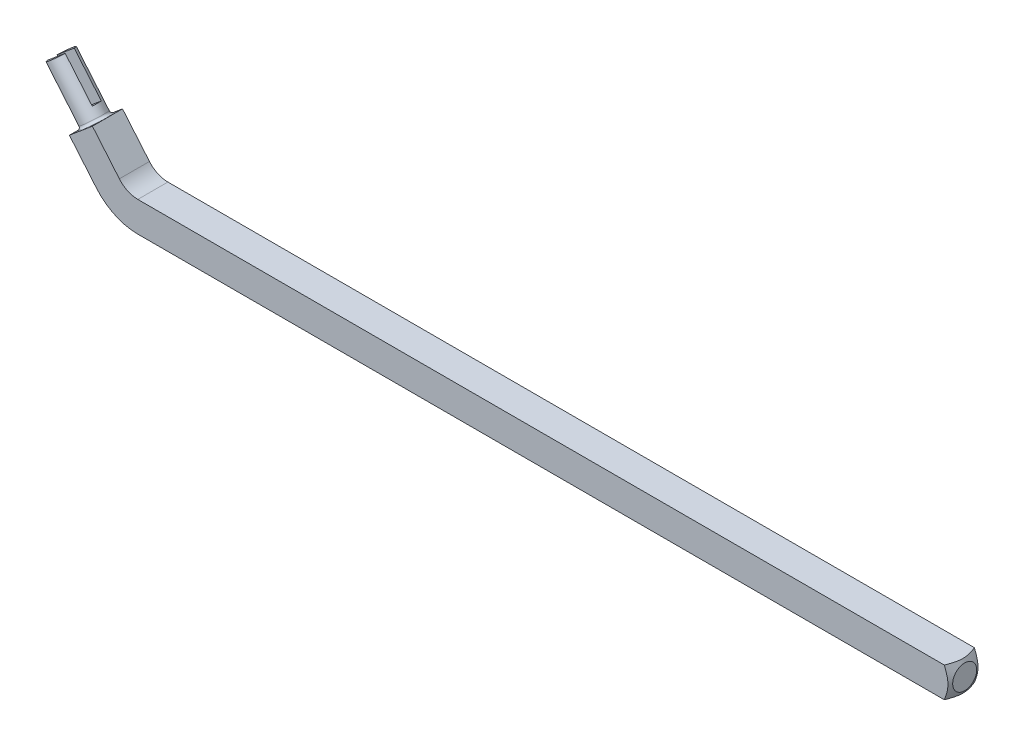
ISO-10303-21;
HEADER;
FILE_DESCRIPTION(('STEP AP214'),'2;1');
FILE_NAME('part.step','',(''),(''),'','','');
FILE_SCHEMA(('AUTOMOTIVE_DESIGN { 1 0 10303 214 1 1 1 1 }'));
ENDSEC;
DATA;
#1=APPLICATION_CONTEXT('core data for automotive mechanical design processes');
#2=APPLICATION_PROTOCOL_DEFINITION('international standard','automotive_design',2000,#1);
#3=PRODUCT_CONTEXT('',#1,'mechanical');
#4=PRODUCT('Part','Part','',(#3));
#5=PRODUCT_RELATED_PRODUCT_CATEGORY('part','',(#4));
#6=PRODUCT_DEFINITION_FORMATION('','',#4);
#7=PRODUCT_DEFINITION_CONTEXT('part definition',#1,'design');
#8=PRODUCT_DEFINITION('design','',#6,#7);
#9=PRODUCT_DEFINITION_SHAPE('','',#8);
#10=(LENGTH_UNIT() NAMED_UNIT(*) SI_UNIT(.MILLI.,.METRE.));
#11=(NAMED_UNIT(*) PLANE_ANGLE_UNIT() SI_UNIT($,.RADIAN.));
#12=(NAMED_UNIT(*) SI_UNIT($,.STERADIAN.) SOLID_ANGLE_UNIT());
#13=UNCERTAINTY_MEASURE_WITH_UNIT(LENGTH_MEASURE(1.E-05),#10,'distance_accuracy_value','');
#14=(GEOMETRIC_REPRESENTATION_CONTEXT(3) GLOBAL_UNCERTAINTY_ASSIGNED_CONTEXT((#13)) GLOBAL_UNIT_ASSIGNED_CONTEXT((#10,
#11,#12)) REPRESENTATION_CONTEXT('',''));
#15=CARTESIAN_POINT('',(0.,0.,0.));
#16=DIRECTION('',(0.,0.,1.));
#17=DIRECTION('',(1.,0.,0.));
#18=AXIS2_PLACEMENT_3D('',#15,#16,#17);
#19=CARTESIAN_POINT('',(-8.34298720466287,6.0534754069734,-2.5));
#20=DIRECTION('',(-0.642787609686543,0.766044443118975,0.));
#21=DIRECTION('',(-0.766044443118975,-0.642787609686543,0.));
#22=AXIS2_PLACEMENT_3D('',#19,#20,#21);
#23=PLANE('',#22);
#24=DIRECTION('',(0.,0.,1.));
#25=VECTOR('',#24,1.);
#26=CARTESIAN_POINT('',(-8.34298720466287,6.0534754069734,-2.5));
#27=LINE('',#26,#25);
#28=CARTESIAN_POINT('',(-8.34298720466287,6.0534754069734,-2.5));
#29=VERTEX_POINT('',#28);
#30=CARTESIAN_POINT('',(-8.34298720466287,6.0534754069734,0.));
#31=VERTEX_POINT('',#30);
#32=EDGE_CURVE('E275',#29,#31,#27,.T.);
#33=ORIENTED_EDGE('',*,*,#32,.T.);
#34=CARTESIAN_POINT('',(-6.42787609686543,7.66044443118975,0.));
#35=DIRECTION('',(-0.642787609686543,0.766044443118975,0.));
#36=DIRECTION('',(-0.766044443118975,-0.642787609686543,0.));
#37=AXIS2_PLACEMENT_3D('',#34,#35,#36);
#38=CIRCLE('',#37,2.5);
#39=CARTESIAN_POINT('',(-6.42787609686543,7.66044443118975,-2.5));
#40=VERTEX_POINT('',#39);
#41=EDGE_CURVE('E13',#31,#40,#38,.F.);
#42=ORIENTED_EDGE('',*,*,#41,.T.);
#43=DIRECTION('',(-0.766044443118975,-0.642787609686543,0.));
#44=VECTOR('',#43,1.);
#45=CARTESIAN_POINT('',(-8.34298720466287,6.0534754069734,-2.5));
#46=LINE('',#45,#44);
#47=EDGE_CURVE('E277',#40,#29,#46,.T.);
#48=ORIENTED_EDGE('',*,*,#47,.T.);
#49=EDGE_LOOP('',(#33,#42,#48));
#50=FACE_BOUND('',#49,.T.);
#51=ADVANCED_FACE('F54',(#50),#23,.T.);
#52=CARTESIAN_POINT('',(-4.512764989068,9.26741345540611,-2.5));
#53=VERTEX_POINT('',#52);
#54=EDGE_CURVE('E375',#53,#40,#46,.T.);
#55=ORIENTED_EDGE('',*,*,#54,.T.);
#56=CARTESIAN_POINT('',(-6.42787609686543,7.66044443118975,0.));
#57=DIRECTION('',(-0.642787609686543,0.766044443118975,0.));
#58=DIRECTION('',(-0.766044443118975,-0.642787609686543,0.));
#59=AXIS2_PLACEMENT_3D('',#56,#57,#58);
#60=CIRCLE('',#59,2.5);
#61=CARTESIAN_POINT('',(-4.512764989068,9.26741345540611,0.));
#62=VERTEX_POINT('',#61);
#63=EDGE_CURVE('E63',#40,#62,#60,.F.);
#64=ORIENTED_EDGE('',*,*,#63,.T.);
#65=DIRECTION('',(0.,0.,1.));
#66=VECTOR('',#65,1.);
#67=CARTESIAN_POINT('',(-4.512764989068,9.26741345540611,-2.5));
#68=LINE('',#67,#66);
#69=EDGE_CURVE('E383',#53,#62,#68,.T.);
#70=ORIENTED_EDGE('',*,*,#69,.F.);
#71=EDGE_LOOP('',(#55,#64,#70));
#72=FACE_BOUND('',#71,.T.);
#73=ADVANCED_FACE('F268',(#72),#23,.T.);
#74=CARTESIAN_POINT('',(-4.512764989068,9.26741345540611,2.5));
#75=VERTEX_POINT('',#74);
#76=EDGE_CURVE('E380',#62,#75,#68,.T.);
#77=ORIENTED_EDGE('',*,*,#76,.F.);
#78=CARTESIAN_POINT('',(-6.42787609686543,7.66044443118975,0.));
#79=DIRECTION('',(-0.642787609686543,0.766044443118975,0.));
#80=DIRECTION('',(-0.766044443118975,-0.642787609686543,0.));
#81=AXIS2_PLACEMENT_3D('',#78,#79,#80);
#82=CIRCLE('',#81,2.5);
#83=CARTESIAN_POINT('',(-6.42787609686543,7.66044443118975,2.5));
#84=VERTEX_POINT('',#83);
#85=EDGE_CURVE('E287',#62,#84,#82,.F.);
#86=ORIENTED_EDGE('',*,*,#85,.T.);
#87=DIRECTION('',(-0.766044443118975,-0.642787609686543,0.));
#88=VECTOR('',#87,1.);
#89=CARTESIAN_POINT('',(-8.34298720466287,6.0534754069734,2.5));
#90=LINE('',#89,#88);
#91=EDGE_CURVE('E358',#75,#84,#90,.T.);
#92=ORIENTED_EDGE('',*,*,#91,.F.);
#93=EDGE_LOOP('',(#77,#86,#92));
#94=FACE_BOUND('',#93,.T.);
#95=ADVANCED_FACE('F261',(#94),#23,.T.);
#96=CARTESIAN_POINT('',(-12.2129645840443,14.5548444192605,0.));
#97=DIRECTION('',(-0.642787609686543,0.766044443118975,0.));
#98=DIRECTION('',(-0.766044443118975,-0.642787609686543,0.));
#99=AXIS2_PLACEMENT_3D('',#96,#97,#98);
#100=PLANE('',#99);
#101=DIRECTION('',(0.766044443118975,0.642787609686543,0.));
#102=VECTOR('',#101,1.);
#103=CARTESIAN_POINT('',(-12.2129645840443,14.5548444192605,0.749999999999999));
#104=LINE('',#103,#102);
#105=CARTESIAN_POINT('',(-13.6332489940711,13.3630842946402,0.749999999999999));
#106=VERTEX_POINT('',#105);
#107=CARTESIAN_POINT('',(-10.7926801740176,15.7466045438808,0.749999999999999));
#108=VERTEX_POINT('',#107);
#109=EDGE_CURVE('E166',#106,#108,#104,.T.);
#110=ORIENTED_EDGE('',*,*,#109,.F.);
#111=CARTESIAN_POINT('',(-12.2129645840443,14.5548444192605,0.));
#112=DIRECTION('',(-0.642787609686543,0.766044443118975,0.));
#113=DIRECTION('',(-0.766044443118975,-0.642787609686543,0.));
#114=AXIS2_PLACEMENT_3D('',#111,#112,#113);
#115=CIRCLE('',#114,2.);
#116=EDGE_CURVE('E181',#106,#108,#115,.T.);
#117=ORIENTED_EDGE('',*,*,#116,.T.);
#118=EDGE_LOOP('',(#110,#117));
#119=FACE_BOUND('',#118,.T.);
#120=ADVANCED_FACE('F409',(#119),#100,.T.);
#121=CARTESIAN_POINT('',(-1.16576914538749,-2.5,-2.5));
#122=DIRECTION('',(0.,-1.,0.));
#123=DIRECTION('',(0.,0.,-1.));
#124=AXIS2_PLACEMENT_3D('',#121,#122,#123);
#125=PLANE('',#124);
#126=DIRECTION('',(1.,0.,0.));
#127=VECTOR('',#126,1.);
#128=CARTESIAN_POINT('',(-1.16576914538749,-2.5,2.5));
#129=LINE('',#128,#127);
#130=CARTESIAN_POINT('',(3.03099977800747,-2.5,2.5));
#131=VERTEX_POINT('',#130);
#132=CARTESIAN_POINT('',(137.11345908606,-2.5,2.5));
#133=VERTEX_POINT('',#132);
#134=EDGE_CURVE('E247',#131,#133,#129,.T.);
#135=ORIENTED_EDGE('',*,*,#134,.F.);
#136=DIRECTION('',(0.,0.,1.));
#137=VECTOR('',#136,1.);
#138=CARTESIAN_POINT('',(3.03099977800747,-2.5,-2.5));
#139=LINE('',#138,#137);
#140=CARTESIAN_POINT('',(3.03099977800747,-2.5,-2.5));
#141=VERTEX_POINT('',#140);
#142=EDGE_CURVE('E308',#131,#141,#139,.F.);
#143=ORIENTED_EDGE('',*,*,#142,.T.);
#144=DIRECTION('',(1.,0.,0.));
#145=VECTOR('',#144,1.);
#146=CARTESIAN_POINT('',(-1.16576914538749,-2.5,-2.5));
#147=LINE('',#146,#145);
#148=CARTESIAN_POINT('',(137.11345908606,-2.5,-2.5));
#149=VERTEX_POINT('',#148);
#150=EDGE_CURVE('E346',#141,#149,#147,.T.);
#151=ORIENTED_EDGE('',*,*,#150,.T.);
#152=CARTESIAN_POINT('',(134.265798622587,-2.5,-8.09036994374947));
#153=CARTESIAN_POINT('',(134.364325071174,-2.5,-7.91174397533074));
#154=CARTESIAN_POINT('',(134.462642816484,-2.5,-7.73300244143315));
#155=CARTESIAN_POINT('',(134.658748374971,-2.5,-7.37522634154136));
#156=CARTESIAN_POINT('',(134.75653618213,-2.5,-7.19619177224946));
#157=CARTESIAN_POINT('',(134.9515144638,-2.5,-6.83768465921551));
#158=CARTESIAN_POINT('',(135.048704624945,-2.5,-6.65821194491864));
#159=CARTESIAN_POINT('',(135.242279610896,-2.5,-6.29883347076645));
#160=CARTESIAN_POINT('',(135.338664439387,-2.5,-6.11892771289773));
#161=CARTESIAN_POINT('',(135.531991673756,-2.5,-5.75561570489188));
#162=CARTESIAN_POINT('',(135.628917244225,-2.5,-5.57220048581406));
#163=CARTESIAN_POINT('',(135.821409670884,-2.5,-5.20465875354999));
#164=CARTESIAN_POINT('',(135.916976535032,-2.5,-5.02053224453755));
#165=CARTESIAN_POINT('',(136.106296399159,-2.5,-4.65139729768638));
#166=CARTESIAN_POINT('',(136.200049788191,-2.5,-4.46638905986643));
#167=CARTESIAN_POINT('',(136.385127954238,-2.5,-4.09516444076155));
#168=CARTESIAN_POINT('',(136.476452795391,-2.5,-3.90894809154498));
#169=CARTESIAN_POINT('',(136.657220802573,-2.5,-3.53178230740229));
#170=CARTESIAN_POINT('',(136.746607503788,-2.5,-3.3408056357966));
#171=CARTESIAN_POINT('',(136.920370635018,-2.5,-2.95651698734556));
#172=CARTESIAN_POINT('',(137.004745823123,-2.5,-2.76320444580987));
#173=CARTESIAN_POINT('',(137.165841954031,-2.5,-2.37384979418392));
#174=CARTESIAN_POINT('',(137.242579438558,-2.5,-2.17781467927853));
#175=CARTESIAN_POINT('',(137.349054610207,-2.5,-1.88070005057552));
#176=CARTESIAN_POINT('',(137.383102089547,-2.5,-1.78117100722463));
#177=CARTESIAN_POINT('',(137.447618748707,-2.5,-1.5809189106024));
#178=CARTESIAN_POINT('',(137.478086781975,-2.5,-1.48019548606441));
#179=CARTESIAN_POINT('',(137.544671389408,-2.5,-1.24139647827977));
#180=CARTESIAN_POINT('',(137.578936136689,-2.5,-1.10279161799555));
#181=CARTESIAN_POINT('',(137.636907163404,-2.5,-0.823422082106642));
#182=CARTESIAN_POINT('',(137.660619992429,-2.5,-0.682658802528919));
#183=CARTESIAN_POINT('',(137.695070559895,-2.5,-0.400493610699158));
#184=CARTESIAN_POINT('',(137.705897273818,-2.5,-0.259102924670878));
#185=CARTESIAN_POINT('',(137.713564996173,-2.5,0.0240732922924882));
#186=CARTESIAN_POINT('',(137.710407327643,-2.5,0.16585878460728));
#187=CARTESIAN_POINT('',(137.694382354105,-2.5,0.393753584749213));
#188=CARTESIAN_POINT('',(137.685742284477,-2.5,0.480189240983088));
#189=CARTESIAN_POINT('',(137.663765272104,-2.5,0.65246646602329));
#190=CARTESIAN_POINT('',(137.650427881064,-2.5,0.73830797732912));
#191=CARTESIAN_POINT('',(137.604085884971,-2.5,0.994784224473355));
#192=CARTESIAN_POINT('',(137.564758712941,-2.5,1.16428078829332));
#193=CARTESIAN_POINT('',(137.472699592075,-2.5,1.50346061082879));
#194=CARTESIAN_POINT('',(137.419691749003,-2.5,1.67306592586023));
#195=CARTESIAN_POINT('',(137.333401313365,-2.5,1.9250779331676));
#196=CARTESIAN_POINT('',(137.30351089151,-2.5,2.00867558792489));
#197=CARTESIAN_POINT('',(137.241826697825,-2.5,2.1751649697745));
#198=CARTESIAN_POINT('',(137.210032962114,-2.5,2.25805671022884));
#199=CARTESIAN_POINT('',(137.125585639625,-2.5,2.47207281476906));
#200=CARTESIAN_POINT('',(137.07171974973,-2.5,2.60271766268198));
#201=CARTESIAN_POINT('',(136.960960147072,-2.5,2.862722132208));
#202=CARTESIAN_POINT('',(136.904066152504,-2.5,2.99208163286878));
#203=CARTESIAN_POINT('',(136.787940878976,-2.5,3.24979174851261));
#204=CARTESIAN_POINT('',(136.728708885655,-2.5,3.37814204054657));
#205=CARTESIAN_POINT('',(136.608434508829,-2.5,3.63399311044653));
#206=CARTESIAN_POINT('',(136.547392074517,-2.5,3.76149386434806));
#207=CARTESIAN_POINT('',(136.361967683909,-2.5,4.14332926557269));
#208=CARTESIAN_POINT('',(136.235457299503,-2.5,4.39662912608293));
#209=CARTESIAN_POINT('',(135.978815505331,-2.5,4.90131505529341));
#210=CARTESIAN_POINT('',(135.84868476501,-2.5,5.15270146700614));
#211=CARTESIAN_POINT('',(135.59899955628,-2.5,5.62920865528513));
#212=CARTESIAN_POINT('',(135.479681444776,-2.5,5.85445350174167));
#213=CARTESIAN_POINT('',(135.239552823108,-2.5,6.30416058698997));
#214=CARTESIAN_POINT('',(135.118742232589,-2.5,6.52862278280244));
#215=CARTESIAN_POINT('',(134.876388341815,-2.5,6.976238634142));
#216=CARTESIAN_POINT('',(134.754848537991,-2.5,7.19939418506569));
#217=CARTESIAN_POINT('',(134.510910018402,-2.5,7.64521460497603));
#218=CARTESIAN_POINT('',(134.388511365282,-2.5,7.86787950822606));
#219=CARTESIAN_POINT('',(134.265798622587,-2.5,8.09036994374947));
#220=B_SPLINE_CURVE_WITH_KNOTS('',3,(#152,#153,#154,#155,#156,#157,#158,#159,#160,#161,#162,
#163,#164,#165,#166,#167,#168,#169,#170,#171,#172,#173,#174,#175,#176,#177,#178,#179,#180,#181,
#182,#183,#184,#185,#186,#187,#188,#189,#190,#191,#192,#193,#194,#195,#196,#197,#198,#199,#200,
#201,#202,#203,#204,#205,#206,#207,#208,#209,#210,#211,#212,#213,#214,#215,#216,#217,#218,#219),
.UNSPECIFIED.,.F.,.F.,(4,2,2,2,2,2,2,2,2,2,2,2,2,2,2,2,2,2,2,2,2,2,2,2,2,2,2,2,2,2,2,2,2,4),(0.,
0.611990871957453,1.22398867901651,1.83628388567891,2.44857628875396,3.07092344841238,
3.69326696169653,4.31547544591525,4.93766748114063,5.57019594714834,6.20288051255682,
6.83416354832187,7.14968337444959,7.46530399253116,7.89331133141584,8.32105263365622,
8.74582302832444,9.17055323705397,9.43102870420546,9.69152903688075,10.2127989082309,
10.7455377658767,11.0118618191968,11.2781808200966,11.7020680839718,12.12599486528,
12.5500521929596,12.9741214325797,13.8234738159649,14.6726701748433,15.4373510405286,
16.2020732574193,16.9643918988286,17.7266555018219),.UNSPECIFIED.);
#221=EDGE_CURVE('E205',#149,#133,#220,.T.);
#222=ORIENTED_EDGE('',*,*,#221,.T.);
#223=EDGE_LOOP('',(#135,#143,#151,#222));
#224=FACE_BOUND('',#223,.T.);
#225=ADVANCED_FACE('F343',(#224),#125,.T.);
#226=CARTESIAN_POINT('',(1.16576914538749,2.5,-2.5));
#227=DIRECTION('',(0.,1.,0.));
#228=DIRECTION('',(0.,0.,1.));
#229=AXIS2_PLACEMENT_3D('',#226,#227,#228);
#230=PLANE('',#229);
#231=DIRECTION('',(-1.,0.,0.));
#232=VECTOR('',#231,1.);
#233=CARTESIAN_POINT('',(1.16576914538749,2.5,-2.5));
#234=LINE('',#233,#232);
#235=CARTESIAN_POINT('',(137.11345908606,2.5,-2.5));
#236=VERTEX_POINT('',#235);
#237=CARTESIAN_POINT('',(3.03099977800747,2.5,-2.5));
#238=VERTEX_POINT('',#237);
#239=EDGE_CURVE('E367',#236,#238,#234,.T.);
#240=ORIENTED_EDGE('',*,*,#239,.T.);
#241=DIRECTION('',(0.,0.,1.));
#242=VECTOR('',#241,1.);
#243=CARTESIAN_POINT('',(3.03099977800747,2.5,2.5));
#244=LINE('',#243,#242);
#245=CARTESIAN_POINT('',(3.03099977800747,2.5,2.5));
#246=VERTEX_POINT('',#245);
#247=EDGE_CURVE('E326',#238,#246,#244,.T.);
#248=ORIENTED_EDGE('',*,*,#247,.T.);
#249=DIRECTION('',(-1.,0.,0.));
#250=VECTOR('',#249,1.);
#251=CARTESIAN_POINT('',(1.16576914538749,2.5,2.5));
#252=LINE('',#251,#250);
#253=CARTESIAN_POINT('',(137.11345908606,2.5,2.5));
#254=VERTEX_POINT('',#253);
#255=EDGE_CURVE('E350',#254,#246,#252,.T.);
#256=ORIENTED_EDGE('',*,*,#255,.F.);
#257=CARTESIAN_POINT('',(134.265798622587,2.5,8.09036994374947));
#258=CARTESIAN_POINT('',(134.364325071174,2.5,7.91174397533074));
#259=CARTESIAN_POINT('',(134.462642816484,2.5,7.73300244143315));
#260=CARTESIAN_POINT('',(134.658748374971,2.5,7.37522634154136));
#261=CARTESIAN_POINT('',(134.75653618213,2.5,7.19619177224946));
#262=CARTESIAN_POINT('',(134.9515144638,2.5,6.83768465921551));
#263=CARTESIAN_POINT('',(135.048704624945,2.5,6.65821194491864));
#264=CARTESIAN_POINT('',(135.242279610896,2.5,6.29883347076645));
#265=CARTESIAN_POINT('',(135.338664439387,2.5,6.11892771289773));
#266=CARTESIAN_POINT('',(135.531991673756,2.5,5.75561570489188));
#267=CARTESIAN_POINT('',(135.628917244225,2.5,5.57220048581406));
#268=CARTESIAN_POINT('',(135.821409670884,2.5,5.20465875354999));
#269=CARTESIAN_POINT('',(135.916976535032,2.5,5.02053224453755));
#270=CARTESIAN_POINT('',(136.106296399159,2.5,4.65139729768638));
#271=CARTESIAN_POINT('',(136.200049788191,2.5,4.46638905986643));
#272=CARTESIAN_POINT('',(136.385127954238,2.5,4.09516444076155));
#273=CARTESIAN_POINT('',(136.476452795391,2.5,3.90894809154498));
#274=CARTESIAN_POINT('',(136.657220802573,2.5,3.53178230740229));
#275=CARTESIAN_POINT('',(136.746607503788,2.5,3.3408056357966));
#276=CARTESIAN_POINT('',(136.920370635018,2.5,2.95651698734556));
#277=CARTESIAN_POINT('',(137.004745823123,2.5,2.76320444580987));
#278=CARTESIAN_POINT('',(137.165841954031,2.5,2.37384979418392));
#279=CARTESIAN_POINT('',(137.242579438558,2.5,2.17781467927853));
#280=CARTESIAN_POINT('',(137.349054610207,2.5,1.88070005057552));
#281=CARTESIAN_POINT('',(137.383102089547,2.5,1.78117100722463));
#282=CARTESIAN_POINT('',(137.447618748707,2.5,1.5809189106024));
#283=CARTESIAN_POINT('',(137.478086781975,2.5,1.48019548606441));
#284=CARTESIAN_POINT('',(137.544671389408,2.5,1.24139647827977));
#285=CARTESIAN_POINT('',(137.578936136689,2.5,1.10279161799555));
#286=CARTESIAN_POINT('',(137.636907163404,2.5,0.823422082106642));
#287=CARTESIAN_POINT('',(137.660619992429,2.5,0.682658802528919));
#288=CARTESIAN_POINT('',(137.695070559895,2.5,0.400493610699158));
#289=CARTESIAN_POINT('',(137.705897273818,2.5,0.259102924670878));
#290=CARTESIAN_POINT('',(137.713564996173,2.5,-0.0240732922924882));
#291=CARTESIAN_POINT('',(137.710407327643,2.5,-0.16585878460728));
#292=CARTESIAN_POINT('',(137.694382354105,2.5,-0.393753584749213));
#293=CARTESIAN_POINT('',(137.685742284477,2.5,-0.480189240983088));
#294=CARTESIAN_POINT('',(137.663765272104,2.5,-0.65246646602329));
#295=CARTESIAN_POINT('',(137.650427881064,2.5,-0.73830797732912));
#296=CARTESIAN_POINT('',(137.604085884971,2.5,-0.994784224473355));
#297=CARTESIAN_POINT('',(137.564758712941,2.5,-1.16428078829332));
#298=CARTESIAN_POINT('',(137.472699592075,2.5,-1.50346061082879));
#299=CARTESIAN_POINT('',(137.419691749003,2.5,-1.67306592586023));
#300=CARTESIAN_POINT('',(137.333401313365,2.5,-1.9250779331676));
#301=CARTESIAN_POINT('',(137.30351089151,2.5,-2.00867558792489));
#302=CARTESIAN_POINT('',(137.241826697825,2.5,-2.1751649697745));
#303=CARTESIAN_POINT('',(137.210032962114,2.5,-2.25805671022884));
#304=CARTESIAN_POINT('',(137.125585639625,2.5,-2.47207281476906));
#305=CARTESIAN_POINT('',(137.07171974973,2.5,-2.60271766268198));
#306=CARTESIAN_POINT('',(136.960960147072,2.5,-2.862722132208));
#307=CARTESIAN_POINT('',(136.904066152504,2.5,-2.99208163286878));
#308=CARTESIAN_POINT('',(136.787940878976,2.5,-3.24979174851261));
#309=CARTESIAN_POINT('',(136.728708885655,2.5,-3.37814204054657));
#310=CARTESIAN_POINT('',(136.608434508829,2.5,-3.63399311044653));
#311=CARTESIAN_POINT('',(136.547392074517,2.5,-3.76149386434806));
#312=CARTESIAN_POINT('',(136.361967683909,2.5,-4.14332926557269));
#313=CARTESIAN_POINT('',(136.235457299503,2.5,-4.39662912608293));
#314=CARTESIAN_POINT('',(135.978815505331,2.5,-4.90131505529341));
#315=CARTESIAN_POINT('',(135.84868476501,2.5,-5.15270146700614));
#316=CARTESIAN_POINT('',(135.59899955628,2.5,-5.62920865528513));
#317=CARTESIAN_POINT('',(135.479681444776,2.5,-5.85445350174167));
#318=CARTESIAN_POINT('',(135.239552823108,2.5,-6.30416058698997));
#319=CARTESIAN_POINT('',(135.118742232589,2.5,-6.52862278280244));
#320=CARTESIAN_POINT('',(134.876388341815,2.5,-6.976238634142));
#321=CARTESIAN_POINT('',(134.754848537991,2.5,-7.19939418506569));
#322=CARTESIAN_POINT('',(134.510910018402,2.5,-7.64521460497603));
#323=CARTESIAN_POINT('',(134.388511365282,2.5,-7.86787950822606));
#324=CARTESIAN_POINT('',(134.265798622587,2.5,-8.09036994374947));
#325=B_SPLINE_CURVE_WITH_KNOTS('',3,(#257,#258,#259,#260,#261,#262,#263,#264,#265,#266,#267,
#268,#269,#270,#271,#272,#273,#274,#275,#276,#277,#278,#279,#280,#281,#282,#283,#284,#285,#286,
#287,#288,#289,#290,#291,#292,#293,#294,#295,#296,#297,#298,#299,#300,#301,#302,#303,#304,#305,
#306,#307,#308,#309,#310,#311,#312,#313,#314,#315,#316,#317,#318,#319,#320,#321,#322,#323,#324),
.UNSPECIFIED.,.F.,.F.,(4,2,2,2,2,2,2,2,2,2,2,2,2,2,2,2,2,2,2,2,2,2,2,2,2,2,2,2,2,2,2,2,2,4),(0.,
0.611990871957453,1.22398867901651,1.83628388567891,2.44857628875396,3.07092344841238,
3.69326696169653,4.31547544591525,4.93766748114063,5.57019594714834,6.20288051255682,
6.83416354832187,7.14968337444959,7.46530399253116,7.89331133141584,8.32105263365622,
8.74582302832444,9.17055323705397,9.43102870420546,9.69152903688075,10.2127989082309,
10.7455377658767,11.0118618191968,11.2781808200966,11.7020680839718,12.12599486528,
12.5500521929596,12.9741214325797,13.8234738159649,14.6726701748433,15.4373510405286,
16.2020732574193,16.9643918988286,17.7266555018219),.UNSPECIFIED.);
#326=EDGE_CURVE('E195',#254,#236,#325,.T.);
#327=ORIENTED_EDGE('',*,*,#326,.T.);
#328=EDGE_LOOP('',(#240,#248,#256,#327));
#329=FACE_BOUND('',#328,.T.);
#330=ADVANCED_FACE('F212',(#329),#230,.T.);
#331=CARTESIAN_POINT('',(0.,0.,-2.5));
#332=DIRECTION('',(0.,0.,-1.));
#333=DIRECTION('',(-1.,0.,0.));
#334=AXIS2_PLACEMENT_3D('',#331,#332,#333);
#335=PLANE('',#334);
#336=ORIENTED_EDGE('',*,*,#150,.F.);
#337=CARTESIAN_POINT('',(3.03099977800747,6.5,-2.5));
#338=DIRECTION('',(0.,0.,-1.));
#339=DIRECTION('',(-1.,0.,0.));
#340=AXIS2_PLACEMENT_3D('',#337,#338,#339);
#341=CIRCLE('',#340,9.);
#342=CARTESIAN_POINT('',(-3.8634002100633,0.714911512821113,-2.5));
#343=VERTEX_POINT('',#342);
#344=EDGE_CURVE('E167',#141,#343,#341,.T.);
#345=ORIENTED_EDGE('',*,*,#344,.T.);
#346=DIRECTION('',(0.642787609686543,-0.766044443118975,0.));
#347=VECTOR('',#346,1.);
#348=CARTESIAN_POINT('',(-1.16576914538749,-2.5,-2.5));
#349=LINE('',#348,#347);
#350=EDGE_CURVE('E378',#29,#343,#349,.T.);
#351=ORIENTED_EDGE('',*,*,#350,.F.);
#352=ORIENTED_EDGE('',*,*,#47,.F.);
#353=ORIENTED_EDGE('',*,*,#54,.F.);
#354=DIRECTION('',(-0.642787609686543,0.766044443118975,0.));
#355=VECTOR('',#354,1.);
#356=CARTESIAN_POINT('',(1.16576914538749,2.5,-2.5));
#357=LINE('',#356,#355);
#358=CARTESIAN_POINT('',(-0.0331779944684281,3.92884956125383,-2.5));
#359=VERTEX_POINT('',#358);
#360=EDGE_CURVE('E370',#359,#53,#357,.T.);
#361=ORIENTED_EDGE('',*,*,#360,.F.);
#362=CARTESIAN_POINT('',(3.03099977800747,6.5,-2.5));
#363=DIRECTION('',(0.,0.,-1.));
#364=DIRECTION('',(-1.,0.,0.));
#365=AXIS2_PLACEMENT_3D('',#362,#363,#364);
#366=CIRCLE('',#365,4.);
#367=EDGE_CURVE('E318',#359,#238,#366,.F.);
#368=ORIENTED_EDGE('',*,*,#367,.T.);
#369=ORIENTED_EDGE('',*,*,#239,.F.);
#370=CARTESIAN_POINT('',(130.08582268717,15.507534827962,-2.5));
#371=CARTESIAN_POINT('',(130.275302107926,15.1751051353781,-2.5));
#372=CARTESIAN_POINT('',(130.464669012834,14.8426112583486,-2.5));
#373=CARTESIAN_POINT('',(130.843118352795,14.1774612148115,-2.5));
#374=CARTESIAN_POINT('',(131.032200787561,13.8448050481397,-2.5));
#375=CARTESIAN_POINT('',(131.5989597056,12.8464938312834,-2.5));
#376=CARTESIAN_POINT('',(131.976119647899,12.1805454188807,-2.5));
#377=CARTESIAN_POINT('',(132.726907497775,10.8498742958408,-2.5));
#378=CARTESIAN_POINT('',(133.100543284606,10.1851560402845,-2.5));
#379=CARTESIAN_POINT('',(133.658178697366,9.18652541291896,-2.5));
#380=CARTESIAN_POINT('',(133.843582972074,8.85339780218145,-2.5));
#381=CARTESIAN_POINT('',(134.213088222969,8.18642056780289,-2.5));
#382=CARTESIAN_POINT('',(134.397189201966,7.85257094572098,-2.5));
#383=CARTESIAN_POINT('',(134.76503775024,7.1811373184536,-2.5));
#384=CARTESIAN_POINT('',(134.948770234031,6.84354504134917,-2.5));
#385=CARTESIAN_POINT('',(135.313481630404,6.16682894912033,-2.5));
#386=CARTESIAN_POINT('',(135.494460283408,5.82770499347791,-2.5));
#387=CARTESIAN_POINT('',(135.762896710531,5.31675921008155,-2.5));
#388=CARTESIAN_POINT('',(135.852003922606,5.14580467327606,-2.5));
#389=CARTESIAN_POINT('',(136.028770521245,4.80315110887172,-2.5));
#390=CARTESIAN_POINT('',(136.116429933276,4.63145209443572,-2.5));
#391=CARTESIAN_POINT('',(136.289837072819,4.28712265532786,-2.5));
#392=CARTESIAN_POINT('',(136.375585097074,4.11449238047544,-2.5));
#393=CARTESIAN_POINT('',(136.544522303079,3.76798559275498,-2.5));
#394=CARTESIAN_POINT('',(136.627711555321,3.59410911438102,-2.5));
#395=CARTESIAN_POINT('',(136.793630021211,3.23812290722685,-2.5));
#396=CARTESIAN_POINT('',(136.876223902248,3.05594973510771,-2.5));
#397=CARTESIAN_POINT('',(137.035938358458,2.68923325729656,-2.5));
#398=CARTESIAN_POINT('',(137.113059923101,2.50469038724141,-2.5));
#399=CARTESIAN_POINT('',(137.258995323105,2.13298968879249,-2.5));
#400=CARTESIAN_POINT('',(137.327834982675,1.94584213217271,-2.5));
#401=CARTESIAN_POINT('',(137.453420368284,1.56748063198944,-2.5));
#402=CARTESIAN_POINT('',(137.510171493101,1.37626854579717,-2.5));
#403=CARTESIAN_POINT('',(137.591570202788,1.04653345239356,-2.5));
#404=CARTESIAN_POINT('',(137.620748598925,0.90914845549541,-2.5));
#405=CARTESIAN_POINT('',(137.667806202548,0.632453533730651,-2.5));
#406=CARTESIAN_POINT('',(137.685690183434,0.493144447521497,-2.5));
#407=CARTESIAN_POINT('',(137.708236794972,0.213939848439439,-2.5));
#408=CARTESIAN_POINT('',(137.712947739572,0.0740483680845739,-2.5));
#409=CARTESIAN_POINT('',(137.708703822618,-0.205546567796481,-2.5));
#410=CARTESIAN_POINT('',(137.699747264892,-0.345249997831543,-2.5));
#411=CARTESIAN_POINT('',(137.674233908305,-0.577789248780979,-2.5));
#412=CARTESIAN_POINT('',(137.661115919033,-0.671026256972999,-2.5));
#413=CARTESIAN_POINT('',(137.629798137234,-0.856648994711105,-2.5));
#414=CARTESIAN_POINT('',(137.611597574708,-0.949034593078177,-2.5));
#415=CARTESIAN_POINT('',(137.550395984583,-1.22485666511349,-2.5));
#416=CARTESIAN_POINT('',(137.500809934226,-1.40683829328163,-2.5));
#417=CARTESIAN_POINT('',(137.416675673618,-1.67874748506408,-2.5));
#418=CARTESIAN_POINT('',(137.38663932656,-1.77015253547588,-2.5));
#419=CARTESIAN_POINT('',(137.32392528735,-1.95206073883127,-2.5));
#420=CARTESIAN_POINT('',(137.291247582613,-2.04256388747498,-2.5));
#421=CARTESIAN_POINT('',(137.223745894164,-2.22271302075016,-2.5));
#422=CARTESIAN_POINT('',(137.188922871656,-2.31235936876885,-2.5));
#423=CARTESIAN_POINT('',(137.117494923015,-2.4909338216801,-2.5));
#424=CARTESIAN_POINT('',(137.080890057615,-2.57986195093303,-2.5));
#425=CARTESIAN_POINT('',(136.955059816137,-2.8785443423688,-2.5));
#426=CARTESIAN_POINT('',(136.86246488201,-3.08687773757698,-2.5));
#427=CARTESIAN_POINT('',(136.671948965923,-3.50110443301786,-2.5));
#428=CARTESIAN_POINT('',(136.574027038301,-3.70699729204728,-2.5));
#429=CARTESIAN_POINT('',(136.374507068469,-4.1171118583749,-2.5));
#430=CARTESIAN_POINT('',(136.272907268739,-4.32133270796714,-2.5));
#431=CARTESIAN_POINT('',(136.067150736393,-4.7284833189082,-2.5));
#432=CARTESIAN_POINT('',(135.962993938977,-4.93141304737246,-2.5));
#433=CARTESIAN_POINT('',(135.752631173666,-5.33667559655643,-2.5));
#434=CARTESIAN_POINT('',(135.646421815669,-5.53900665422173,-2.5));
#435=CARTESIAN_POINT('',(135.432605534529,-5.94293188751103,-2.5));
#436=CARTESIAN_POINT('',(135.324998588749,-6.14452605113119,-2.5));
#437=CARTESIAN_POINT('',(135.000664583838,-6.74833436262808,-2.5));
#438=CARTESIAN_POINT('',(134.782358627392,-7.14969983259247,-2.5));
#439=CARTESIAN_POINT('',(134.373155791861,-7.89627250403941,-2.5));
#440=CARTESIAN_POINT('',(134.182588620784,-8.24166113251483,-2.5));
#441=CARTESIAN_POINT('',(133.800071054475,-8.93171255834625,-2.5));
#442=CARTESIAN_POINT('',(133.608120535001,-9.27637528682284,-2.5));
#443=CARTESIAN_POINT('',(133.223873315074,-9.96401530005941,-2.5));
#444=CARTESIAN_POINT('',(133.031579847504,-10.3069943933538,-2.5));
#445=CARTESIAN_POINT('',(132.646267238133,-10.9925001718393,-2.5));
#446=CARTESIAN_POINT('',(132.453248170009,-11.3350268984326,-2.5));
#447=CARTESIAN_POINT('',(132.259971799731,-11.6774078090398,-2.5));
#448=B_SPLINE_CURVE_WITH_KNOTS('',3,(#370,#371,#372,#373,#374,#375,#376,#377,#378,#379,#380,
#381,#382,#383,#384,#385,#386,#387,#388,#389,#390,#391,#392,#393,#394,#395,#396,#397,#398,#399,
#400,#401,#402,#403,#404,#405,#406,#407,#408,#409,#410,#411,#412,#413,#414,#415,#416,#417,#418,
#419,#420,#421,#422,#423,#424,#425,#426,#427,#428,#429,#430,#431,#432,#433,#434,#435,#436,#437,
#438,#439,#440,#441,#442,#443,#444,#445,#446,#447),.UNSPECIFIED.,.F.,.F.,(4,2,2,2,2,2,2,2,2,2,2,
2,2,2,2,2,2,2,2,2,2,2,2,2,2,2,2,2,2,2,2,2,2,2,2,2,2,2,4),(0.,1.14791447876443,2.29583012140722,
4.5918318678132,6.87941744342249,8.02315447443068,9.16688903807268,10.3199371075142,
11.4730931993827,12.0514392235283,12.6297750634949,13.2080204828754,13.7862499581572,
14.3862574701092,14.9861562145724,15.5841330412375,16.1818422470613,16.6028199765343,
17.0236196673308,17.4428739794263,17.8621803262614,18.1445039176717,18.4268703036718,
18.9919645318684,19.2805875290991,19.5692119017037,19.8577078843638,20.1461940404437,
20.8300082790386,21.5139443087845,22.1982115964411,22.8824962430108,23.5680285909555,
24.2535720567492,25.62423399689,26.8076509769561,27.9911756008685,29.1707944876237,
30.3502966676981),.UNSPECIFIED.);
#449=EDGE_CURVE('E239',#236,#149,#448,.T.);
#450=ORIENTED_EDGE('',*,*,#449,.T.);
#451=EDGE_LOOP('',(#336,#345,#351,#352,#353,#361,#368,#369,#450));
#452=FACE_BOUND('',#451,.T.);
#453=ADVANCED_FACE('F249',(#452),#335,.T.);
#454=CARTESIAN_POINT('',(0.,0.,2.5));
#455=DIRECTION('',(0.,0.,-1.));
#456=DIRECTION('',(-1.,0.,0.));
#457=AXIS2_PLACEMENT_3D('',#454,#455,#456);
#458=PLANE('',#457);
#459=DIRECTION('',(0.642787609686543,-0.766044443118975,0.));
#460=VECTOR('',#459,1.);
#461=CARTESIAN_POINT('',(-1.16576914538749,-2.5,2.5));
#462=LINE('',#461,#460);
#463=CARTESIAN_POINT('',(-8.34298720466287,6.0534754069734,2.5));
#464=VERTEX_POINT('',#463);
#465=CARTESIAN_POINT('',(-3.8634002100633,0.714911512821113,2.5));
#466=VERTEX_POINT('',#465);
#467=EDGE_CURVE('E362',#464,#466,#462,.T.);
#468=ORIENTED_EDGE('',*,*,#467,.T.);
#469=CARTESIAN_POINT('',(3.03099977800747,6.5,2.5));
#470=DIRECTION('',(0.,0.,-1.));
#471=DIRECTION('',(-1.,0.,0.));
#472=AXIS2_PLACEMENT_3D('',#469,#470,#471);
#473=CIRCLE('',#472,9.);
#474=EDGE_CURVE('E311',#466,#131,#473,.F.);
#475=ORIENTED_EDGE('',*,*,#474,.T.);
#476=ORIENTED_EDGE('',*,*,#134,.T.);
#477=CARTESIAN_POINT('',(130.08582268717,15.507534827962,2.5));
#478=CARTESIAN_POINT('',(130.275302107926,15.1751051353781,2.5));
#479=CARTESIAN_POINT('',(130.464669012834,14.8426112583486,2.5));
#480=CARTESIAN_POINT('',(130.843118352795,14.1774612148115,2.5));
#481=CARTESIAN_POINT('',(131.032200787561,13.8448050481397,2.5));
#482=CARTESIAN_POINT('',(131.5989597056,12.8464938312834,2.5));
#483=CARTESIAN_POINT('',(131.976119647899,12.1805454188807,2.5));
#484=CARTESIAN_POINT('',(132.726907497775,10.8498742958408,2.5));
#485=CARTESIAN_POINT('',(133.100543284606,10.1851560402845,2.5));
#486=CARTESIAN_POINT('',(133.658178697366,9.18652541291896,2.5));
#487=CARTESIAN_POINT('',(133.843582972074,8.85339780218145,2.5));
#488=CARTESIAN_POINT('',(134.213088222969,8.18642056780289,2.5));
#489=CARTESIAN_POINT('',(134.397189201966,7.85257094572098,2.5));
#490=CARTESIAN_POINT('',(134.76503775024,7.1811373184536,2.5));
#491=CARTESIAN_POINT('',(134.948770234031,6.84354504134917,2.5));
#492=CARTESIAN_POINT('',(135.313481630404,6.16682894912033,2.5));
#493=CARTESIAN_POINT('',(135.494460283408,5.82770499347791,2.5));
#494=CARTESIAN_POINT('',(135.762896710531,5.31675921008155,2.5));
#495=CARTESIAN_POINT('',(135.852003922606,5.14580467327606,2.5));
#496=CARTESIAN_POINT('',(136.028770521245,4.80315110887172,2.5));
#497=CARTESIAN_POINT('',(136.116429933276,4.63145209443572,2.5));
#498=CARTESIAN_POINT('',(136.289837072819,4.28712265532786,2.5));
#499=CARTESIAN_POINT('',(136.375585097074,4.11449238047544,2.5));
#500=CARTESIAN_POINT('',(136.544522303079,3.76798559275498,2.5));
#501=CARTESIAN_POINT('',(136.627711555321,3.59410911438102,2.5));
#502=CARTESIAN_POINT('',(136.793630021211,3.23812290722685,2.5));
#503=CARTESIAN_POINT('',(136.876223902248,3.05594973510771,2.5));
#504=CARTESIAN_POINT('',(137.035938358458,2.68923325729656,2.5));
#505=CARTESIAN_POINT('',(137.113059923101,2.50469038724141,2.5));
#506=CARTESIAN_POINT('',(137.258995323105,2.13298968879249,2.5));
#507=CARTESIAN_POINT('',(137.327834982675,1.94584213217271,2.5));
#508=CARTESIAN_POINT('',(137.453420368284,1.56748063198944,2.5));
#509=CARTESIAN_POINT('',(137.510171493101,1.37626854579717,2.5));
#510=CARTESIAN_POINT('',(137.591570202788,1.04653345239356,2.5));
#511=CARTESIAN_POINT('',(137.620748598925,0.90914845549541,2.5));
#512=CARTESIAN_POINT('',(137.667806202548,0.632453533730651,2.5));
#513=CARTESIAN_POINT('',(137.685690183434,0.493144447521497,2.5));
#514=CARTESIAN_POINT('',(137.708236794972,0.213939848439439,2.5));
#515=CARTESIAN_POINT('',(137.712947739572,0.0740483680845739,2.5));
#516=CARTESIAN_POINT('',(137.708703822618,-0.205546567796481,2.5));
#517=CARTESIAN_POINT('',(137.699747264892,-0.345249997831543,2.5));
#518=CARTESIAN_POINT('',(137.674233908305,-0.577789248780979,2.5));
#519=CARTESIAN_POINT('',(137.661115919033,-0.671026256972999,2.5));
#520=CARTESIAN_POINT('',(137.629798137234,-0.856648994711105,2.5));
#521=CARTESIAN_POINT('',(137.611597574708,-0.949034593078177,2.5));
#522=CARTESIAN_POINT('',(137.550395984583,-1.22485666511349,2.5));
#523=CARTESIAN_POINT('',(137.500809934226,-1.40683829328163,2.5));
#524=CARTESIAN_POINT('',(137.416675673618,-1.67874748506408,2.5));
#525=CARTESIAN_POINT('',(137.38663932656,-1.77015253547588,2.5));
#526=CARTESIAN_POINT('',(137.32392528735,-1.95206073883127,2.5));
#527=CARTESIAN_POINT('',(137.291247582613,-2.04256388747498,2.5));
#528=CARTESIAN_POINT('',(137.223745894164,-2.22271302075016,2.5));
#529=CARTESIAN_POINT('',(137.188922871656,-2.31235936876885,2.5));
#530=CARTESIAN_POINT('',(137.117494923015,-2.4909338216801,2.5));
#531=CARTESIAN_POINT('',(137.080890057615,-2.57986195093303,2.5));
#532=CARTESIAN_POINT('',(136.955059816137,-2.8785443423688,2.5));
#533=CARTESIAN_POINT('',(136.86246488201,-3.08687773757698,2.5));
#534=CARTESIAN_POINT('',(136.671948965923,-3.50110443301786,2.5));
#535=CARTESIAN_POINT('',(136.574027038301,-3.70699729204728,2.5));
#536=CARTESIAN_POINT('',(136.374507068469,-4.1171118583749,2.5));
#537=CARTESIAN_POINT('',(136.272907268739,-4.32133270796714,2.5));
#538=CARTESIAN_POINT('',(136.067150736393,-4.7284833189082,2.5));
#539=CARTESIAN_POINT('',(135.962993938977,-4.93141304737246,2.5));
#540=CARTESIAN_POINT('',(135.752631173666,-5.33667559655643,2.5));
#541=CARTESIAN_POINT('',(135.646421815669,-5.53900665422173,2.5));
#542=CARTESIAN_POINT('',(135.432605534529,-5.94293188751103,2.5));
#543=CARTESIAN_POINT('',(135.324998588749,-6.14452605113119,2.5));
#544=CARTESIAN_POINT('',(135.000664583838,-6.74833436262808,2.5));
#545=CARTESIAN_POINT('',(134.782358627392,-7.14969983259247,2.5));
#546=CARTESIAN_POINT('',(134.373155791861,-7.89627250403941,2.5));
#547=CARTESIAN_POINT('',(134.182588620784,-8.24166113251483,2.5));
#548=CARTESIAN_POINT('',(133.800071054475,-8.93171255834625,2.5));
#549=CARTESIAN_POINT('',(133.608120535001,-9.27637528682284,2.5));
#550=CARTESIAN_POINT('',(133.223873315074,-9.96401530005941,2.5));
#551=CARTESIAN_POINT('',(133.031579847504,-10.3069943933538,2.5));
#552=CARTESIAN_POINT('',(132.646267238133,-10.9925001718393,2.5));
#553=CARTESIAN_POINT('',(132.453248170009,-11.3350268984326,2.5));
#554=CARTESIAN_POINT('',(132.259971799731,-11.6774078090398,2.5));
#555=B_SPLINE_CURVE_WITH_KNOTS('',3,(#477,#478,#479,#480,#481,#482,#483,#484,#485,#486,#487,
#488,#489,#490,#491,#492,#493,#494,#495,#496,#497,#498,#499,#500,#501,#502,#503,#504,#505,#506,
#507,#508,#509,#510,#511,#512,#513,#514,#515,#516,#517,#518,#519,#520,#521,#522,#523,#524,#525,
#526,#527,#528,#529,#530,#531,#532,#533,#534,#535,#536,#537,#538,#539,#540,#541,#542,#543,#544,
#545,#546,#547,#548,#549,#550,#551,#552,#553,#554),.UNSPECIFIED.,.F.,.F.,(4,2,2,2,2,2,2,2,2,2,2,
2,2,2,2,2,2,2,2,2,2,2,2,2,2,2,2,2,2,2,2,2,2,2,2,2,2,2,4),(0.,1.14791447876443,2.29583012140722,
4.5918318678132,6.87941744342249,8.02315447443068,9.16688903807268,10.3199371075142,
11.4730931993827,12.0514392235283,12.6297750634949,13.2080204828754,13.7862499581572,
14.3862574701092,14.9861562145724,15.5841330412375,16.1818422470613,16.6028199765343,
17.0236196673308,17.4428739794263,17.8621803262614,18.1445039176717,18.4268703036718,
18.9919645318684,19.2805875290991,19.5692119017037,19.8577078843638,20.1461940404437,
20.8300082790386,21.5139443087845,22.1982115964411,22.8824962430108,23.5680285909555,
24.2535720567492,25.62423399689,26.8076509769561,27.9911756008685,29.1707944876237,
30.3502966676981),.UNSPECIFIED.);
#556=EDGE_CURVE('E231',#254,#133,#555,.T.);
#557=ORIENTED_EDGE('',*,*,#556,.F.);
#558=ORIENTED_EDGE('',*,*,#255,.T.);
#559=CARTESIAN_POINT('',(3.03099977800747,6.5,2.5));
#560=DIRECTION('',(0.,0.,-1.));
#561=DIRECTION('',(-1.,0.,0.));
#562=AXIS2_PLACEMENT_3D('',#559,#560,#561);
#563=CIRCLE('',#562,4.);
#564=CARTESIAN_POINT('',(-0.0331779944684281,3.92884956125383,2.5));
#565=VERTEX_POINT('',#564);
#566=EDGE_CURVE('E321',#246,#565,#563,.T.);
#567=ORIENTED_EDGE('',*,*,#566,.T.);
#568=DIRECTION('',(-0.642787609686543,0.766044443118975,0.));
#569=VECTOR('',#568,1.);
#570=CARTESIAN_POINT('',(1.16576914538749,2.5,2.5));
#571=LINE('',#570,#569);
#572=EDGE_CURVE('E352',#565,#75,#571,.T.);
#573=ORIENTED_EDGE('',*,*,#572,.T.);
#574=ORIENTED_EDGE('',*,*,#91,.T.);
#575=EDGE_CURVE('E355',#84,#464,#90,.T.);
#576=ORIENTED_EDGE('',*,*,#575,.T.);
#577=EDGE_LOOP('',(#468,#475,#476,#557,#558,#567,#573,#574,#576));
#578=FACE_BOUND('',#577,.T.);
#579=ADVANCED_FACE('F225',(#578),#458,.F.);
#580=CARTESIAN_POINT('',(-1.16576914538749,-2.5,-2.5));
#581=DIRECTION('',(-0.766044443118975,-0.642787609686543,0.));
#582=DIRECTION('',(0.642787609686543,-0.766044443118975,0.));
#583=AXIS2_PLACEMENT_3D('',#580,#581,#582);
#584=PLANE('',#583);
#585=ORIENTED_EDGE('',*,*,#350,.T.);
#586=DIRECTION('',(0.,0.,1.));
#587=VECTOR('',#586,1.);
#588=CARTESIAN_POINT('',(-3.8634002100633,0.714911512821113,-2.5));
#589=LINE('',#588,#587);
#590=EDGE_CURVE('E314',#343,#466,#589,.T.);
#591=ORIENTED_EDGE('',*,*,#590,.T.);
#592=ORIENTED_EDGE('',*,*,#467,.F.);
#593=EDGE_CURVE('E282',#31,#464,#27,.T.);
#594=ORIENTED_EDGE('',*,*,#593,.F.);
#595=ORIENTED_EDGE('',*,*,#32,.F.);
#596=EDGE_LOOP('',(#585,#591,#592,#594,#595));
#597=FACE_BOUND('',#596,.T.);
#598=ADVANCED_FACE('F254',(#597),#584,.T.);
#599=ORIENTED_EDGE('',*,*,#575,.F.);
#600=CARTESIAN_POINT('',(-6.42787609686543,7.66044443118975,0.));
#601=DIRECTION('',(-0.642787609686543,0.766044443118975,0.));
#602=DIRECTION('',(-0.766044443118975,-0.642787609686543,0.));
#603=AXIS2_PLACEMENT_3D('',#600,#601,#602);
#604=CIRCLE('',#603,2.5);
#605=EDGE_CURVE('E286',#84,#31,#604,.F.);
#606=ORIENTED_EDGE('',*,*,#605,.T.);
#607=ORIENTED_EDGE('',*,*,#593,.T.);
#608=EDGE_LOOP('',(#599,#606,#607));
#609=FACE_BOUND('',#608,.T.);
#610=ADVANCED_FACE('F257',(#609),#23,.T.);
#611=CARTESIAN_POINT('',(1.16576914538749,2.5,-2.5));
#612=DIRECTION('',(0.766044443118975,0.642787609686543,0.));
#613=DIRECTION('',(-0.642787609686543,0.766044443118975,0.));
#614=AXIS2_PLACEMENT_3D('',#611,#612,#613);
#615=PLANE('',#614);
#616=ORIENTED_EDGE('',*,*,#572,.F.);
#617=DIRECTION('',(0.,0.,1.));
#618=VECTOR('',#617,1.);
#619=CARTESIAN_POINT('',(-0.0331779944684283,3.92884956125383,-2.5));
#620=LINE('',#619,#618);
#621=EDGE_CURVE('E324',#565,#359,#620,.F.);
#622=ORIENTED_EDGE('',*,*,#621,.T.);
#623=ORIENTED_EDGE('',*,*,#360,.T.);
#624=ORIENTED_EDGE('',*,*,#69,.T.);
#625=ORIENTED_EDGE('',*,*,#76,.T.);
#626=EDGE_LOOP('',(#616,#622,#623,#624,#625));
#627=FACE_BOUND('',#626,.T.);
#628=ADVANCED_FACE('F222',(#627),#615,.T.);
#629=CARTESIAN_POINT('',(138.,0.,0.));
#630=DIRECTION('',(-1.,0.,0.));
#631=DIRECTION('',(0.,0.,-1.));
#632=AXIS2_PLACEMENT_3D('',#629,#630,#631);
#633=CONICAL_SURFACE('',#632,2.,1.0471975511966);
#634=ORIENTED_EDGE('',*,*,#326,.F.);
#635=ORIENTED_EDGE('',*,*,#556,.T.);
#636=ORIENTED_EDGE('',*,*,#221,.F.);
#637=ORIENTED_EDGE('',*,*,#449,.F.);
#638=EDGE_LOOP('',(#634,#635,#636,#637));
#639=FACE_BOUND('',#638,.T.);
#640=CARTESIAN_POINT('',(138.,0.,0.));
#641=DIRECTION('',(1.,0.,0.));
#642=DIRECTION('',(0.,0.,-1.));
#643=AXIS2_PLACEMENT_3D('',#640,#641,#642);
#644=CIRCLE('',#643,2.);
#645=CARTESIAN_POINT('',(138.,0.,-2.));
#646=VERTEX_POINT('',#645);
#647=EDGE_CURVE('E187',#646,#646,#644,.T.);
#648=ORIENTED_EDGE('',*,*,#647,.F.);
#649=EDGE_LOOP('',(#648));
#650=FACE_BOUND('',#649,.T.);
#651=ADVANCED_FACE('F216',(#639,#650),#633,.T.);
#652=CARTESIAN_POINT('',(138.,2.5,-2.5));
#653=DIRECTION('',(1.,0.,0.));
#654=DIRECTION('',(0.,0.,-1.));
#655=AXIS2_PLACEMENT_3D('',#652,#653,#654);
#656=PLANE('',#655);
#657=ORIENTED_EDGE('',*,*,#647,.T.);
#658=EDGE_LOOP('',(#657));
#659=FACE_BOUND('',#658,.T.);
#660=ADVANCED_FACE('F221',(#659),#656,.T.);
#661=CARTESIAN_POINT('',(3.03099977800747,6.5,-2.5));
#662=DIRECTION('',(0.,0.,-1.));
#663=DIRECTION('',(-1.,0.,0.));
#664=AXIS2_PLACEMENT_3D('',#661,#662,#663);
#665=CYLINDRICAL_SURFACE('',#664,4.);
#666=ORIENTED_EDGE('',*,*,#367,.F.);
#667=ORIENTED_EDGE('',*,*,#621,.F.);
#668=ORIENTED_EDGE('',*,*,#566,.F.);
#669=ORIENTED_EDGE('',*,*,#247,.F.);
#670=EDGE_LOOP('',(#666,#667,#668,#669));
#671=FACE_BOUND('',#670,.T.);
#672=ADVANCED_FACE('F399',(#671),#665,.F.);
#673=CARTESIAN_POINT('',(3.03099977800747,6.5,-2.5));
#674=DIRECTION('',(0.,0.,1.));
#675=DIRECTION('',(1.,0.,0.));
#676=AXIS2_PLACEMENT_3D('',#673,#674,#675);
#677=CYLINDRICAL_SURFACE('',#676,9.);
#678=ORIENTED_EDGE('',*,*,#344,.F.);
#679=ORIENTED_EDGE('',*,*,#142,.F.);
#680=ORIENTED_EDGE('',*,*,#474,.F.);
#681=ORIENTED_EDGE('',*,*,#590,.F.);
#682=EDGE_LOOP('',(#678,#679,#680,#681));
#683=FACE_BOUND('',#682,.T.);
#684=ADVANCED_FACE('F395',(#683),#677,.T.);
#685=CARTESIAN_POINT('',(-12.2129645840443,14.5548444192605,0.));
#686=DIRECTION('',(0.642787609686543,-0.766044443118975,0.));
#687=DIRECTION('',(0.766044443118975,0.642787609686543,0.));
#688=AXIS2_PLACEMENT_3D('',#685,#686,#687);
#689=CYLINDRICAL_SURFACE('',#688,2.);
#690=CARTESIAN_POINT('',(-6.74926990170871,8.04346665274924,0.));
#691=DIRECTION('',(-0.642787609686543,0.766044443118975,0.));
#692=DIRECTION('',(-0.766044443118975,-0.642787609686543,0.));
#693=AXIS2_PLACEMENT_3D('',#690,#691,#692);
#694=CIRCLE('',#693,2.);
#695=CARTESIAN_POINT('',(-8.28135878794666,6.75789143337615,0.));
#696=VERTEX_POINT('',#695);
#697=EDGE_CURVE('E291',#696,#696,#694,.T.);
#698=ORIENTED_EDGE('',*,*,#697,.T.);
#699=EDGE_LOOP('',(#698));
#700=FACE_BOUND('',#699,.T.);
#701=ORIENTED_EDGE('',*,*,#116,.F.);
#702=DIRECTION('',(0.642787609686543,-0.766044443118975,0.));
#703=VECTOR('',#702,1.);
#704=CARTESIAN_POINT('',(-13.6332489940711,13.3630842946402,0.749999999999999));
#705=LINE('',#704,#703);
#706=CARTESIAN_POINT('',(-9.13373572626528,8.00077319280742,0.749999999999999));
#707=VERTEX_POINT('',#706);
#708=EDGE_CURVE('E182',#106,#707,#705,.T.);
#709=ORIENTED_EDGE('',*,*,#708,.T.);
#710=CARTESIAN_POINT('',(-7.71345131623854,9.19253331742772,0.));
#711=DIRECTION('',(0.642787609686543,-0.766044443118975,0.));
#712=DIRECTION('',(0.766044443118975,0.642787609686543,0.));
#713=AXIS2_PLACEMENT_3D('',#710,#711,#712);
#714=CIRCLE('',#713,2.);
#715=CARTESIAN_POINT('',(-9.13373572626528,8.00077319280742,-0.749999999999999));
#716=VERTEX_POINT('',#715);
#717=EDGE_CURVE('E175',#707,#716,#714,.T.);
#718=ORIENTED_EDGE('',*,*,#717,.T.);
#719=DIRECTION('',(0.642787609686543,-0.766044443118975,0.));
#720=VECTOR('',#719,1.);
#721=CARTESIAN_POINT('',(-13.6332489940711,13.3630842946402,-0.749999999999999));
#722=LINE('',#721,#720);
#723=CARTESIAN_POINT('',(-13.6332489940711,13.3630842946402,-0.749999999999999));
#724=VERTEX_POINT('',#723);
#725=EDGE_CURVE('E158',#716,#724,#722,.F.);
#726=ORIENTED_EDGE('',*,*,#725,.T.);
#727=CARTESIAN_POINT('',(-10.7926801740176,15.7466045438808,-0.749999999999999));
#728=VERTEX_POINT('',#727);
#729=EDGE_CURVE('E173',#728,#724,#115,.T.);
#730=ORIENTED_EDGE('',*,*,#729,.F.);
#731=DIRECTION('',(0.642787609686543,-0.766044443118975,0.));
#732=VECTOR('',#731,1.);
#733=CARTESIAN_POINT('',(-10.7926801740176,15.7466045438808,-0.749999999999999));
#734=LINE('',#733,#732);
#735=CARTESIAN_POINT('',(-6.29316690621179,10.384293442048,-0.749999999999999));
#736=VERTEX_POINT('',#735);
#737=EDGE_CURVE('E161',#728,#736,#734,.T.);
#738=ORIENTED_EDGE('',*,*,#737,.T.);
#739=CARTESIAN_POINT('',(-6.29316690621179,10.384293442048,0.749999999999999));
#740=VERTEX_POINT('',#739);
#741=EDGE_CURVE('E300',#736,#740,#714,.T.);
#742=ORIENTED_EDGE('',*,*,#741,.T.);
#743=DIRECTION('',(0.642787609686543,-0.766044443118975,0.));
#744=VECTOR('',#743,1.);
#745=CARTESIAN_POINT('',(-10.7926801740176,15.7466045438808,0.749999999999999));
#746=LINE('',#745,#744);
#747=EDGE_CURVE('E188',#740,#108,#746,.F.);
#748=ORIENTED_EDGE('',*,*,#747,.T.);
#749=EDGE_LOOP('',(#701,#709,#718,#726,#730,#738,#742,#748));
#750=FACE_BOUND('',#749,.T.);
#751=ADVANCED_FACE('F172',(#700,#750),#689,.T.);
#752=DIRECTION('',(-0.766044443118975,-0.642787609686543,0.));
#753=VECTOR('',#752,1.);
#754=CARTESIAN_POINT('',(-12.2129645840443,14.5548444192605,-0.749999999999999));
#755=LINE('',#754,#753);
#756=EDGE_CURVE('E154',#728,#724,#755,.T.);
#757=ORIENTED_EDGE('',*,*,#756,.F.);
#758=ORIENTED_EDGE('',*,*,#729,.T.);
#759=EDGE_LOOP('',(#757,#758));
#760=FACE_BOUND('',#759,.T.);
#761=ADVANCED_FACE('F179',(#760),#100,.T.);
#762=CARTESIAN_POINT('',(-7.71345131623854,9.19253331742772,0.));
#763=DIRECTION('',(0.642787609686543,-0.766044443118975,0.));
#764=DIRECTION('',(0.766044443118975,0.642787609686543,0.));
#765=AXIS2_PLACEMENT_3D('',#762,#763,#764);
#766=PLANE('',#765);
#767=DIRECTION('',(0.766044443118975,0.642787609686543,0.));
#768=VECTOR('',#767,1.);
#769=CARTESIAN_POINT('',(-18.0299284349387,0.535981172077478,0.749999999999999));
#770=LINE('',#769,#768);
#771=EDGE_CURVE('E177',#707,#740,#770,.T.);
#772=ORIENTED_EDGE('',*,*,#771,.T.);
#773=ORIENTED_EDGE('',*,*,#741,.F.);
#774=DIRECTION('',(-0.766044443118975,-0.642787609686543,0.));
#775=VECTOR('',#774,1.);
#776=CARTESIAN_POINT('',(-18.0299284349387,0.535981172077478,-0.749999999999999));
#777=LINE('',#776,#775);
#778=EDGE_CURVE('E453',#736,#716,#777,.T.);
#779=ORIENTED_EDGE('',*,*,#778,.T.);
#780=ORIENTED_EDGE('',*,*,#717,.F.);
#781=EDGE_LOOP('',(#772,#773,#779,#780));
#782=FACE_BOUND('',#781,.T.);
#783=ADVANCED_FACE('F421',(#782),#766,.F.);
#784=CARTESIAN_POINT('',(-18.0299284349387,0.535981172077478,0.749999999999999));
#785=DIRECTION('',(0.,0.,1.));
#786=DIRECTION('',(1.,0.,0.));
#787=AXIS2_PLACEMENT_3D('',#784,#785,#786);
#788=PLANE('',#787);
#789=ORIENTED_EDGE('',*,*,#109,.T.);
#790=ORIENTED_EDGE('',*,*,#747,.F.);
#791=ORIENTED_EDGE('',*,*,#771,.F.);
#792=ORIENTED_EDGE('',*,*,#708,.F.);
#793=EDGE_LOOP('',(#789,#790,#791,#792));
#794=FACE_BOUND('',#793,.T.);
#795=ADVANCED_FACE('F426',(#794),#788,.F.);
#796=CARTESIAN_POINT('',(-18.0299284349387,0.535981172077478,-0.749999999999999));
#797=DIRECTION('',(0.,0.,-1.));
#798=DIRECTION('',(-1.,0.,0.));
#799=AXIS2_PLACEMENT_3D('',#796,#797,#798);
#800=PLANE('',#799);
#801=ORIENTED_EDGE('',*,*,#756,.T.);
#802=ORIENTED_EDGE('',*,*,#725,.F.);
#803=ORIENTED_EDGE('',*,*,#778,.F.);
#804=ORIENTED_EDGE('',*,*,#737,.F.);
#805=EDGE_LOOP('',(#801,#802,#803,#804));
#806=FACE_BOUND('',#805,.T.);
#807=ADVANCED_FACE('F156',(#806),#800,.F.);
#808=CARTESIAN_POINT('',(-6.74926990170871,8.04346665274924,0.));
#809=DIRECTION('',(-0.642787609686543,0.766044443118975,0.));
#810=DIRECTION('',(-0.766044443118975,-0.642787609686543,0.));
#811=AXIS2_PLACEMENT_3D('',#808,#809,#810);
#812=TOROIDAL_SURFACE('',#811,2.5,0.5);
#813=ORIENTED_EDGE('',*,*,#63,.F.);
#814=ORIENTED_EDGE('',*,*,#41,.F.);
#815=ORIENTED_EDGE('',*,*,#605,.F.);
#816=ORIENTED_EDGE('',*,*,#85,.F.);
#817=EDGE_LOOP('',(#813,#814,#815,#816));
#818=FACE_BOUND('',#817,.T.);
#819=ORIENTED_EDGE('',*,*,#697,.F.);
#820=EDGE_LOOP('',(#819));
#821=FACE_BOUND('',#820,.T.);
#822=ADVANCED_FACE('F56',(#818,#821),#812,.F.);
#823=CLOSED_SHELL('',(#51,#73,#95,#120,#225,#330,#453,#579,#598,#610,#628,#651,#660,#672,#684,
#751,#761,#783,#795,#807,#822));
#824=MANIFOLD_SOLID_BREP('B2',#823);
#825=ADVANCED_BREP_SHAPE_REPRESENTATION('',(#18,#824),#14);
#826=SHAPE_DEFINITION_REPRESENTATION(#9,#825);
ENDSEC;
END-ISO-10303-21;
